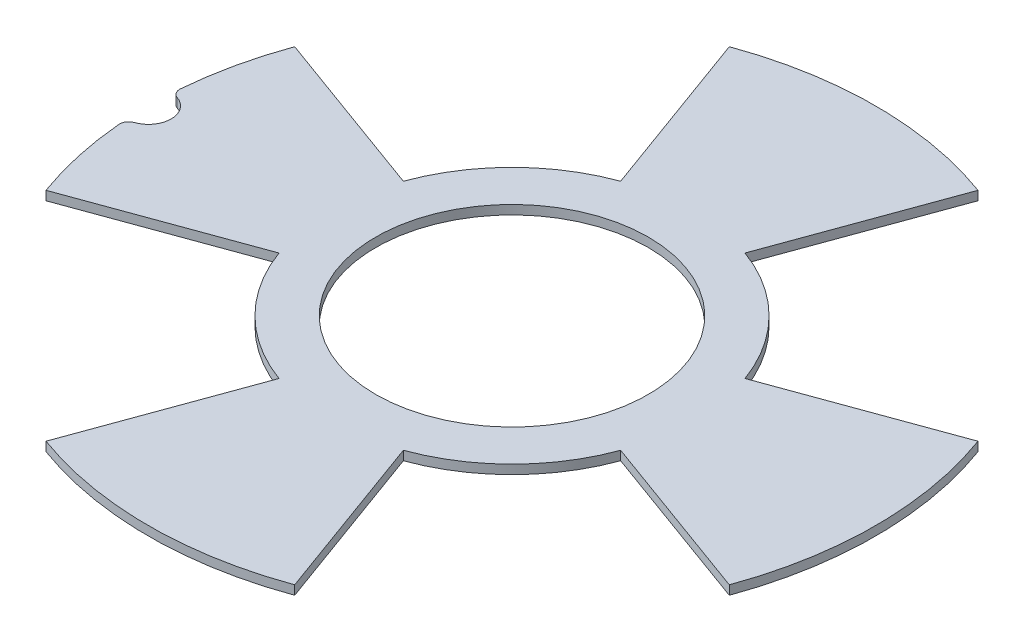
ISO-10303-21;
HEADER;
FILE_DESCRIPTION(('STEP AP214'),'2;1');
FILE_NAME('part.step','',(''),(''),'','','');
FILE_SCHEMA(('AUTOMOTIVE_DESIGN { 1 0 10303 214 1 1 1 1 }'));
ENDSEC;
DATA;
#1=APPLICATION_CONTEXT('core data for automotive mechanical design processes');
#2=APPLICATION_PROTOCOL_DEFINITION('international standard','automotive_design',2000,#1);
#3=PRODUCT_CONTEXT('',#1,'mechanical');
#4=PRODUCT('Part','Part','',(#3));
#5=PRODUCT_RELATED_PRODUCT_CATEGORY('part','',(#4));
#6=PRODUCT_DEFINITION_FORMATION('','',#4);
#7=PRODUCT_DEFINITION_CONTEXT('part definition',#1,'design');
#8=PRODUCT_DEFINITION('design','',#6,#7);
#9=PRODUCT_DEFINITION_SHAPE('','',#8);
#10=(LENGTH_UNIT() NAMED_UNIT(*) SI_UNIT(.MILLI.,.METRE.));
#11=(NAMED_UNIT(*) PLANE_ANGLE_UNIT() SI_UNIT($,.RADIAN.));
#12=(NAMED_UNIT(*) SI_UNIT($,.STERADIAN.) SOLID_ANGLE_UNIT());
#13=UNCERTAINTY_MEASURE_WITH_UNIT(LENGTH_MEASURE(1.E-05),#10,'distance_accuracy_value','');
#14=(GEOMETRIC_REPRESENTATION_CONTEXT(3) GLOBAL_UNCERTAINTY_ASSIGNED_CONTEXT((#13)) GLOBAL_UNIT_ASSIGNED_CONTEXT((#10,
#11,#12)) REPRESENTATION_CONTEXT('',''));
#15=CARTESIAN_POINT('',(0.,0.,0.));
#16=DIRECTION('',(0.,0.,1.));
#17=DIRECTION('',(1.,0.,0.));
#18=AXIS2_PLACEMENT_3D('',#15,#16,#17);
#19=CARTESIAN_POINT('',(-38.859375,1.,-3.3089234819462));
#20=DIRECTION('',(0.,-1.,0.));
#21=DIRECTION('',(0.,0.,-1.));
#22=AXIS2_PLACEMENT_3D('',#19,#20,#21);
#23=PLANE('',#22);
#24=CARTESIAN_POINT('',(-38.859375,1.,-3.3089234819462));
#25=DIRECTION('',(0.,1.,0.));
#26=DIRECTION('',(0.,0.,-1.));
#27=AXIS2_PLACEMENT_3D('',#24,#25,#26);
#28=CIRCLE('',#27,0.999999999999999);
#29=CARTESIAN_POINT('',(-39.8557692307692,1.,-3.39376767379098));
#30=VERTEX_POINT('',#29);
#31=CARTESIAN_POINT('',(-39.1852678571429,1.,-2.36351677281871));
#32=VERTEX_POINT('',#31);
#33=EDGE_CURVE('E241',#30,#32,#28,.T.);
#34=ORIENTED_EDGE('',*,*,#33,.T.);
#35=CARTESIAN_POINT('',(-40.,1.,0.));
#36=DIRECTION('',(0.,-1.,0.));
#37=DIRECTION('',(0.,0.,1.));
#38=AXIS2_PLACEMENT_3D('',#35,#36,#37);
#39=CIRCLE('',#38,2.49999999999999);
#40=CARTESIAN_POINT('',(-39.1852678571429,1.,2.36351677281871));
#41=VERTEX_POINT('',#40);
#42=EDGE_CURVE('E129',#32,#41,#39,.T.);
#43=ORIENTED_EDGE('',*,*,#42,.T.);
#44=CARTESIAN_POINT('',(-38.859375,1.,3.3089234819462));
#45=DIRECTION('',(0.,1.,0.));
#46=DIRECTION('',(0.,0.,-1.));
#47=AXIS2_PLACEMENT_3D('',#44,#45,#46);
#48=CIRCLE('',#47,0.999999999999999);
#49=CARTESIAN_POINT('',(-39.8557692307692,1.,3.39376767379097));
#50=VERTEX_POINT('',#49);
#51=EDGE_CURVE('E292',#41,#50,#48,.T.);
#52=ORIENTED_EDGE('',*,*,#51,.T.);
#53=CARTESIAN_POINT('',(0.,1.,0.));
#54=DIRECTION('',(0.,1.,0.));
#55=DIRECTION('',(0.,0.,1.));
#56=AXIS2_PLACEMENT_3D('',#53,#54,#55);
#57=CIRCLE('',#56,40.);
#58=CARTESIAN_POINT('',(-37.5877048314363,1.,13.6808057330268));
#59=VERTEX_POINT('',#58);
#60=EDGE_CURVE('E311',#50,#59,#57,.T.);
#61=ORIENTED_EDGE('',*,*,#60,.T.);
#62=DIRECTION('',(0.939692620785908,0.,-0.342020143325669));
#63=VECTOR('',#62,1.);
#64=CARTESIAN_POINT('',(-18.7938524157182,1.,6.84040286651339));
#65=LINE('',#64,#63);
#66=CARTESIAN_POINT('',(-18.7938524157182,1.,6.84040286651339));
#67=VERTEX_POINT('',#66);
#68=EDGE_CURVE('E308',#59,#67,#65,.T.);
#69=ORIENTED_EDGE('',*,*,#68,.T.);
#70=CARTESIAN_POINT('',(0.,1.,0.));
#71=DIRECTION('',(0.,1.,0.));
#72=DIRECTION('',(0.,0.,1.));
#73=AXIS2_PLACEMENT_3D('',#70,#71,#72);
#74=CIRCLE('',#73,20.);
#75=CARTESIAN_POINT('',(-6.84040286651339,1.,18.7938524157182));
#76=VERTEX_POINT('',#75);
#77=EDGE_CURVE('E310',#67,#76,#74,.T.);
#78=ORIENTED_EDGE('',*,*,#77,.T.);
#79=DIRECTION('',(-0.342020143325669,0.,0.939692620785908));
#80=VECTOR('',#79,1.);
#81=CARTESIAN_POINT('',(-13.6808057330268,1.,37.5877048314363));
#82=LINE('',#81,#80);
#83=CARTESIAN_POINT('',(-13.6808057330268,1.,37.5877048314363));
#84=VERTEX_POINT('',#83);
#85=EDGE_CURVE('E313',#76,#84,#82,.T.);
#86=ORIENTED_EDGE('',*,*,#85,.T.);
#87=CARTESIAN_POINT('',(0.,1.,0.));
#88=DIRECTION('',(0.,1.,0.));
#89=DIRECTION('',(0.,0.,1.));
#90=AXIS2_PLACEMENT_3D('',#87,#88,#89);
#91=CIRCLE('',#90,40.);
#92=CARTESIAN_POINT('',(13.6808057330268,1.,37.5877048314363));
#93=VERTEX_POINT('',#92);
#94=EDGE_CURVE('E319',#84,#93,#91,.T.);
#95=ORIENTED_EDGE('',*,*,#94,.T.);
#96=DIRECTION('',(-0.34202014332567,0.,-0.939692620785908));
#97=VECTOR('',#96,1.);
#98=CARTESIAN_POINT('',(13.6808057330268,1.,37.5877048314363));
#99=LINE('',#98,#97);
#100=CARTESIAN_POINT('',(6.84040286651344,1.,18.7938524157181));
#101=VERTEX_POINT('',#100);
#102=EDGE_CURVE('E321',#93,#101,#99,.T.);
#103=ORIENTED_EDGE('',*,*,#102,.T.);
#104=CARTESIAN_POINT('',(0.,1.,0.));
#105=DIRECTION('',(0.,1.,0.));
#106=DIRECTION('',(0.,0.,1.));
#107=AXIS2_PLACEMENT_3D('',#104,#105,#106);
#108=CIRCLE('',#107,20.);
#109=CARTESIAN_POINT('',(18.7938524157133,1.,6.84040286652674));
#110=VERTEX_POINT('',#109);
#111=EDGE_CURVE('E323',#101,#110,#108,.T.);
#112=ORIENTED_EDGE('',*,*,#111,.T.);
#113=DIRECTION('',(0.939692620785908,0.,0.342020143325669));
#114=VECTOR('',#113,1.);
#115=CARTESIAN_POINT('',(37.5877048314315,1.,13.6808057330401));
#116=LINE('',#115,#114);
#117=CARTESIAN_POINT('',(37.5877048314315,1.,13.6808057330401));
#118=VERTEX_POINT('',#117);
#119=EDGE_CURVE('E325',#110,#118,#116,.T.);
#120=ORIENTED_EDGE('',*,*,#119,.T.);
#121=CARTESIAN_POINT('',(0.,1.,0.));
#122=DIRECTION('',(0.,1.,0.));
#123=DIRECTION('',(0.,0.,1.));
#124=AXIS2_PLACEMENT_3D('',#121,#122,#123);
#125=CIRCLE('',#124,40.);
#126=CARTESIAN_POINT('',(37.5877048314363,1.,-13.6808057330267));
#127=VERTEX_POINT('',#126);
#128=EDGE_CURVE('E327',#118,#127,#125,.T.);
#129=ORIENTED_EDGE('',*,*,#128,.T.);
#130=DIRECTION('',(-0.939692620785908,0.,0.342020143325669));
#131=VECTOR('',#130,1.);
#132=CARTESIAN_POINT('',(37.5877048314363,1.,-13.6808057330267));
#133=LINE('',#132,#131);
#134=CARTESIAN_POINT('',(18.7938524157182,1.,-6.84040286651334));
#135=VERTEX_POINT('',#134);
#136=EDGE_CURVE('E329',#127,#135,#133,.T.);
#137=ORIENTED_EDGE('',*,*,#136,.T.);
#138=CARTESIAN_POINT('',(0.,1.,0.));
#139=DIRECTION('',(0.,1.,0.));
#140=DIRECTION('',(0.,0.,1.));
#141=AXIS2_PLACEMENT_3D('',#138,#139,#140);
#142=CIRCLE('',#141,20.);
#143=CARTESIAN_POINT('',(6.84040286651338,1.,-18.7938524157182));
#144=VERTEX_POINT('',#143);
#145=EDGE_CURVE('E331',#135,#144,#142,.T.);
#146=ORIENTED_EDGE('',*,*,#145,.T.);
#147=DIRECTION('',(0.342020143325669,0.,-0.939692620785908));
#148=VECTOR('',#147,1.);
#149=CARTESIAN_POINT('',(6.84040286651339,1.,-18.7938524157182));
#150=LINE('',#149,#148);
#151=CARTESIAN_POINT('',(13.6808057330268,1.,-37.5877048314363));
#152=VERTEX_POINT('',#151);
#153=EDGE_CURVE('E333',#144,#152,#150,.T.);
#154=ORIENTED_EDGE('',*,*,#153,.T.);
#155=CARTESIAN_POINT('',(0.,1.,0.));
#156=DIRECTION('',(0.,1.,0.));
#157=DIRECTION('',(0.,0.,1.));
#158=AXIS2_PLACEMENT_3D('',#155,#156,#157);
#159=CIRCLE('',#158,40.);
#160=CARTESIAN_POINT('',(-13.6808057330267,1.,-37.5877048314363));
#161=VERTEX_POINT('',#160);
#162=EDGE_CURVE('E335',#152,#161,#159,.T.);
#163=ORIENTED_EDGE('',*,*,#162,.T.);
#164=DIRECTION('',(0.34202014332567,0.,0.939692620785908));
#165=VECTOR('',#164,1.);
#166=CARTESIAN_POINT('',(-6.84040286651334,1.,-18.7938524157182));
#167=LINE('',#166,#165);
#168=CARTESIAN_POINT('',(-6.84040286651334,1.,-18.7938524157182));
#169=VERTEX_POINT('',#168);
#170=EDGE_CURVE('E184',#161,#169,#167,.T.);
#171=ORIENTED_EDGE('',*,*,#170,.T.);
#172=CARTESIAN_POINT('',(0.,1.,0.));
#173=DIRECTION('',(0.,1.,0.));
#174=DIRECTION('',(0.,0.,1.));
#175=AXIS2_PLACEMENT_3D('',#172,#173,#174);
#176=CIRCLE('',#175,20.);
#177=CARTESIAN_POINT('',(-18.793852415723,1.,-6.84040286650003));
#178=VERTEX_POINT('',#177);
#179=EDGE_CURVE('E178',#169,#178,#176,.T.);
#180=ORIENTED_EDGE('',*,*,#179,.T.);
#181=DIRECTION('',(-0.939692620785908,0.,-0.34202014332567));
#182=VECTOR('',#181,1.);
#183=CARTESIAN_POINT('',(-18.793852415723,1.,-6.84040286650003));
#184=LINE('',#183,#182);
#185=CARTESIAN_POINT('',(-37.5877048314412,1.,-13.6808057330134));
#186=VERTEX_POINT('',#185);
#187=EDGE_CURVE('E182',#178,#186,#184,.T.);
#188=ORIENTED_EDGE('',*,*,#187,.T.);
#189=CARTESIAN_POINT('',(0.,1.,0.));
#190=DIRECTION('',(0.,1.,0.));
#191=DIRECTION('',(0.,0.,1.));
#192=AXIS2_PLACEMENT_3D('',#189,#190,#191);
#193=CIRCLE('',#192,40.);
#194=EDGE_CURVE('E50',#186,#30,#193,.T.);
#195=ORIENTED_EDGE('',*,*,#194,.T.);
#196=EDGE_LOOP('',(#34,#43,#52,#61,#69,#78,#86,#95,#103,#112,#120,#129,#137,#146,#154,#163,#171,
#180,#188,#195));
#197=FACE_BOUND('',#196,.T.);
#198=CARTESIAN_POINT('',(0.,1.,0.));
#199=DIRECTION('',(0.,1.,0.));
#200=DIRECTION('',(0.,0.,1.));
#201=AXIS2_PLACEMENT_3D('',#198,#199,#200);
#202=CIRCLE('',#201,15.);
#203=CARTESIAN_POINT('',(0.,1.,15.));
#204=VERTEX_POINT('',#203);
#205=EDGE_CURVE('E206',#204,#204,#202,.T.);
#206=ORIENTED_EDGE('',*,*,#205,.F.);
#207=EDGE_LOOP('',(#206));
#208=FACE_BOUND('',#207,.T.);
#209=ADVANCED_FACE('F33',(#197,#208),#23,.F.);
#210=CARTESIAN_POINT('',(-38.859375,0.,-3.3089234819462));
#211=DIRECTION('',(0.,-1.,0.));
#212=DIRECTION('',(0.,0.,-1.));
#213=AXIS2_PLACEMENT_3D('',#210,#211,#212);
#214=PLANE('',#213);
#215=CARTESIAN_POINT('',(-38.859375,0.,-3.3089234819462));
#216=DIRECTION('',(0.,1.,0.));
#217=DIRECTION('',(0.,0.,-1.));
#218=AXIS2_PLACEMENT_3D('',#215,#216,#217);
#219=CIRCLE('',#218,0.999999999999999);
#220=CARTESIAN_POINT('',(-39.8557692307692,0.,-3.39376767379098));
#221=VERTEX_POINT('',#220);
#222=CARTESIAN_POINT('',(-39.1852678571429,0.,-2.36351677281871));
#223=VERTEX_POINT('',#222);
#224=EDGE_CURVE('E202',#221,#223,#219,.T.);
#225=ORIENTED_EDGE('',*,*,#224,.F.);
#226=CARTESIAN_POINT('',(0.,0.,0.));
#227=DIRECTION('',(0.,1.,0.));
#228=DIRECTION('',(0.,0.,1.));
#229=AXIS2_PLACEMENT_3D('',#226,#227,#228);
#230=CIRCLE('',#229,40.);
#231=CARTESIAN_POINT('',(-37.5877048314412,0.,-13.6808057330134));
#232=VERTEX_POINT('',#231);
#233=EDGE_CURVE('E121',#232,#221,#230,.T.);
#234=ORIENTED_EDGE('',*,*,#233,.F.);
#235=DIRECTION('',(-0.939692620785908,0.,-0.34202014332567));
#236=VECTOR('',#235,1.);
#237=CARTESIAN_POINT('',(-18.793852415723,0.,-6.84040286650003));
#238=LINE('',#237,#236);
#239=CARTESIAN_POINT('',(-18.793852415723,0.,-6.84040286650003));
#240=VERTEX_POINT('',#239);
#241=EDGE_CURVE('E115',#240,#232,#238,.T.);
#242=ORIENTED_EDGE('',*,*,#241,.F.);
#243=CARTESIAN_POINT('',(0.,0.,0.));
#244=DIRECTION('',(0.,1.,0.));
#245=DIRECTION('',(0.,0.,1.));
#246=AXIS2_PLACEMENT_3D('',#243,#244,#245);
#247=CIRCLE('',#246,20.);
#248=CARTESIAN_POINT('',(-6.84040286651334,0.,-18.7938524157182));
#249=VERTEX_POINT('',#248);
#250=EDGE_CURVE('E192',#249,#240,#247,.T.);
#251=ORIENTED_EDGE('',*,*,#250,.F.);
#252=DIRECTION('',(0.34202014332567,0.,0.939692620785908));
#253=VECTOR('',#252,1.);
#254=CARTESIAN_POINT('',(-6.84040286651334,0.,-18.7938524157182));
#255=LINE('',#254,#253);
#256=CARTESIAN_POINT('',(-13.6808057330267,0.,-37.5877048314363));
#257=VERTEX_POINT('',#256);
#258=EDGE_CURVE('E236',#257,#249,#255,.T.);
#259=ORIENTED_EDGE('',*,*,#258,.F.);
#260=CARTESIAN_POINT('',(0.,0.,0.));
#261=DIRECTION('',(0.,1.,0.));
#262=DIRECTION('',(0.,0.,1.));
#263=AXIS2_PLACEMENT_3D('',#260,#261,#262);
#264=CIRCLE('',#263,40.);
#265=CARTESIAN_POINT('',(13.6808057330268,0.,-37.5877048314363));
#266=VERTEX_POINT('',#265);
#267=EDGE_CURVE('E234',#266,#257,#264,.T.);
#268=ORIENTED_EDGE('',*,*,#267,.F.);
#269=DIRECTION('',(0.342020143325669,0.,-0.939692620785908));
#270=VECTOR('',#269,1.);
#271=CARTESIAN_POINT('',(6.84040286651339,0.,-18.7938524157182));
#272=LINE('',#271,#270);
#273=CARTESIAN_POINT('',(6.84040286651338,0.,-18.7938524157182));
#274=VERTEX_POINT('',#273);
#275=EDGE_CURVE('E232',#274,#266,#272,.T.);
#276=ORIENTED_EDGE('',*,*,#275,.F.);
#277=CARTESIAN_POINT('',(0.,0.,0.));
#278=DIRECTION('',(0.,1.,0.));
#279=DIRECTION('',(0.,0.,1.));
#280=AXIS2_PLACEMENT_3D('',#277,#278,#279);
#281=CIRCLE('',#280,20.);
#282=CARTESIAN_POINT('',(18.7938524157182,0.,-6.84040286651334));
#283=VERTEX_POINT('',#282);
#284=EDGE_CURVE('E230',#283,#274,#281,.T.);
#285=ORIENTED_EDGE('',*,*,#284,.F.);
#286=DIRECTION('',(-0.939692620785908,0.,0.342020143325669));
#287=VECTOR('',#286,1.);
#288=CARTESIAN_POINT('',(37.5877048314363,0.,-13.6808057330267));
#289=LINE('',#288,#287);
#290=CARTESIAN_POINT('',(37.5877048314363,0.,-13.6808057330267));
#291=VERTEX_POINT('',#290);
#292=EDGE_CURVE('E228',#291,#283,#289,.T.);
#293=ORIENTED_EDGE('',*,*,#292,.F.);
#294=CARTESIAN_POINT('',(0.,0.,0.));
#295=DIRECTION('',(0.,1.,0.));
#296=DIRECTION('',(0.,0.,1.));
#297=AXIS2_PLACEMENT_3D('',#294,#295,#296);
#298=CIRCLE('',#297,40.);
#299=CARTESIAN_POINT('',(37.5877048314315,0.,13.6808057330401));
#300=VERTEX_POINT('',#299);
#301=EDGE_CURVE('E226',#300,#291,#298,.T.);
#302=ORIENTED_EDGE('',*,*,#301,.F.);
#303=DIRECTION('',(0.939692620785908,0.,0.342020143325669));
#304=VECTOR('',#303,1.);
#305=CARTESIAN_POINT('',(37.5877048314315,0.,13.6808057330401));
#306=LINE('',#305,#304);
#307=CARTESIAN_POINT('',(18.7938524157133,0.,6.84040286652674));
#308=VERTEX_POINT('',#307);
#309=EDGE_CURVE('E224',#308,#300,#306,.T.);
#310=ORIENTED_EDGE('',*,*,#309,.F.);
#311=CARTESIAN_POINT('',(0.,0.,0.));
#312=DIRECTION('',(0.,1.,0.));
#313=DIRECTION('',(0.,0.,1.));
#314=AXIS2_PLACEMENT_3D('',#311,#312,#313);
#315=CIRCLE('',#314,20.);
#316=CARTESIAN_POINT('',(6.84040286651344,0.,18.7938524157181));
#317=VERTEX_POINT('',#316);
#318=EDGE_CURVE('E222',#317,#308,#315,.T.);
#319=ORIENTED_EDGE('',*,*,#318,.F.);
#320=DIRECTION('',(-0.34202014332567,0.,-0.939692620785908));
#321=VECTOR('',#320,1.);
#322=CARTESIAN_POINT('',(13.6808057330268,0.,37.5877048314363));
#323=LINE('',#322,#321);
#324=CARTESIAN_POINT('',(13.6808057330268,0.,37.5877048314363));
#325=VERTEX_POINT('',#324);
#326=EDGE_CURVE('E220',#325,#317,#323,.T.);
#327=ORIENTED_EDGE('',*,*,#326,.F.);
#328=CARTESIAN_POINT('',(0.,0.,0.));
#329=DIRECTION('',(0.,1.,0.));
#330=DIRECTION('',(0.,0.,1.));
#331=AXIS2_PLACEMENT_3D('',#328,#329,#330);
#332=CIRCLE('',#331,40.);
#333=CARTESIAN_POINT('',(-13.6808057330268,0.,37.5877048314363));
#334=VERTEX_POINT('',#333);
#335=EDGE_CURVE('E218',#334,#325,#332,.T.);
#336=ORIENTED_EDGE('',*,*,#335,.F.);
#337=DIRECTION('',(-0.342020143325669,0.,0.939692620785908));
#338=VECTOR('',#337,1.);
#339=CARTESIAN_POINT('',(-13.6808057330268,0.,37.5877048314363));
#340=LINE('',#339,#338);
#341=CARTESIAN_POINT('',(-6.84040286651339,0.,18.7938524157182));
#342=VERTEX_POINT('',#341);
#343=EDGE_CURVE('E216',#342,#334,#340,.T.);
#344=ORIENTED_EDGE('',*,*,#343,.F.);
#345=CARTESIAN_POINT('',(0.,0.,0.));
#346=DIRECTION('',(0.,1.,0.));
#347=DIRECTION('',(0.,0.,1.));
#348=AXIS2_PLACEMENT_3D('',#345,#346,#347);
#349=CIRCLE('',#348,20.);
#350=CARTESIAN_POINT('',(-18.7938524157182,0.,6.84040286651339));
#351=VERTEX_POINT('',#350);
#352=EDGE_CURVE('E214',#351,#342,#349,.T.);
#353=ORIENTED_EDGE('',*,*,#352,.F.);
#354=DIRECTION('',(0.939692620785908,0.,-0.342020143325669));
#355=VECTOR('',#354,1.);
#356=CARTESIAN_POINT('',(-18.7938524157182,0.,6.84040286651339));
#357=LINE('',#356,#355);
#358=CARTESIAN_POINT('',(-37.5877048314363,0.,13.6808057330268));
#359=VERTEX_POINT('',#358);
#360=EDGE_CURVE('E212',#359,#351,#357,.T.);
#361=ORIENTED_EDGE('',*,*,#360,.F.);
#362=CARTESIAN_POINT('',(0.,0.,0.));
#363=DIRECTION('',(0.,1.,0.));
#364=DIRECTION('',(0.,0.,1.));
#365=AXIS2_PLACEMENT_3D('',#362,#363,#364);
#366=CIRCLE('',#365,40.);
#367=CARTESIAN_POINT('',(-39.8557692307692,0.,3.39376767379097));
#368=VERTEX_POINT('',#367);
#369=EDGE_CURVE('E210',#368,#359,#366,.T.);
#370=ORIENTED_EDGE('',*,*,#369,.F.);
#371=CARTESIAN_POINT('',(-38.859375,0.,3.3089234819462));
#372=DIRECTION('',(0.,1.,0.));
#373=DIRECTION('',(0.,0.,-1.));
#374=AXIS2_PLACEMENT_3D('',#371,#372,#373);
#375=CIRCLE('',#374,0.999999999999999);
#376=CARTESIAN_POINT('',(-39.1852678571429,0.,2.36351677281871));
#377=VERTEX_POINT('',#376);
#378=EDGE_CURVE('E208',#377,#368,#375,.T.);
#379=ORIENTED_EDGE('',*,*,#378,.F.);
#380=CARTESIAN_POINT('',(-40.,0.,0.));
#381=DIRECTION('',(0.,-1.,0.));
#382=DIRECTION('',(0.,0.,1.));
#383=AXIS2_PLACEMENT_3D('',#380,#381,#382);
#384=CIRCLE('',#383,2.49999999999999);
#385=EDGE_CURVE('E205',#223,#377,#384,.T.);
#386=ORIENTED_EDGE('',*,*,#385,.F.);
#387=EDGE_LOOP('',(#225,#234,#242,#251,#259,#268,#276,#285,#293,#302,#310,#319,#327,#336,#344,
#353,#361,#370,#379,#386));
#388=FACE_BOUND('',#387,.T.);
#389=CARTESIAN_POINT('',(0.,0.,0.));
#390=DIRECTION('',(0.,1.,0.));
#391=DIRECTION('',(0.,0.,1.));
#392=AXIS2_PLACEMENT_3D('',#389,#390,#391);
#393=CIRCLE('',#392,15.);
#394=CARTESIAN_POINT('',(0.,0.,15.));
#395=VERTEX_POINT('',#394);
#396=EDGE_CURVE('E586',#395,#395,#393,.T.);
#397=ORIENTED_EDGE('',*,*,#396,.T.);
#398=EDGE_LOOP('',(#397));
#399=FACE_BOUND('',#398,.T.);
#400=ADVANCED_FACE('F296',(#388,#399),#214,.T.);
#401=CARTESIAN_POINT('',(-38.859375,1.,-3.3089234819462));
#402=DIRECTION('',(0.,-1.,0.));
#403=DIRECTION('',(0.,0.,-1.));
#404=AXIS2_PLACEMENT_3D('',#401,#402,#403);
#405=CYLINDRICAL_SURFACE('',#404,0.999999999999999);
#406=ORIENTED_EDGE('',*,*,#224,.T.);
#407=DIRECTION('',(0.,-1.,0.));
#408=VECTOR('',#407,1.);
#409=CARTESIAN_POINT('',(-39.1852678571429,1.,-2.36351677281871));
#410=LINE('',#409,#408);
#411=EDGE_CURVE('E11',#32,#223,#410,.T.);
#412=ORIENTED_EDGE('',*,*,#411,.F.);
#413=ORIENTED_EDGE('',*,*,#33,.F.);
#414=DIRECTION('',(0.,-1.,0.));
#415=VECTOR('',#414,1.);
#416=CARTESIAN_POINT('',(-39.8557692307692,1.,-3.39376767379098));
#417=LINE('',#416,#415);
#418=EDGE_CURVE('E198',#30,#221,#417,.T.);
#419=ORIENTED_EDGE('',*,*,#418,.T.);
#420=EDGE_LOOP('',(#406,#412,#413,#419));
#421=FACE_BOUND('',#420,.T.);
#422=ADVANCED_FACE('F35',(#421),#405,.T.);
#423=CARTESIAN_POINT('',(-40.,1.,0.));
#424=DIRECTION('',(0.,-1.,0.));
#425=DIRECTION('',(0.,0.,-1.));
#426=AXIS2_PLACEMENT_3D('',#423,#424,#425);
#427=CYLINDRICAL_SURFACE('',#426,2.49999999999999);
#428=ORIENTED_EDGE('',*,*,#385,.T.);
#429=DIRECTION('',(0.,-1.,0.));
#430=VECTOR('',#429,1.);
#431=CARTESIAN_POINT('',(-39.1852678571429,1.,2.36351677281871));
#432=LINE('',#431,#430);
#433=EDGE_CURVE('E42',#41,#377,#432,.T.);
#434=ORIENTED_EDGE('',*,*,#433,.F.);
#435=ORIENTED_EDGE('',*,*,#42,.F.);
#436=ORIENTED_EDGE('',*,*,#411,.T.);
#437=EDGE_LOOP('',(#428,#434,#435,#436));
#438=FACE_BOUND('',#437,.T.);
#439=ADVANCED_FACE('F369',(#438),#427,.F.);
#440=CARTESIAN_POINT('',(-38.859375,1.,3.3089234819462));
#441=DIRECTION('',(0.,-1.,0.));
#442=DIRECTION('',(0.,0.,-1.));
#443=AXIS2_PLACEMENT_3D('',#440,#441,#442);
#444=CYLINDRICAL_SURFACE('',#443,0.999999999999999);
#445=ORIENTED_EDGE('',*,*,#378,.T.);
#446=DIRECTION('',(0.,-1.,0.));
#447=VECTOR('',#446,1.);
#448=CARTESIAN_POINT('',(-39.8557692307692,1.,3.39376767379097));
#449=LINE('',#448,#447);
#450=EDGE_CURVE('E284',#50,#368,#449,.T.);
#451=ORIENTED_EDGE('',*,*,#450,.F.);
#452=ORIENTED_EDGE('',*,*,#51,.F.);
#453=ORIENTED_EDGE('',*,*,#433,.T.);
#454=EDGE_LOOP('',(#445,#451,#452,#453));
#455=FACE_BOUND('',#454,.T.);
#456=ADVANCED_FACE('F290',(#455),#444,.T.);
#457=CARTESIAN_POINT('',(0.,1.,0.));
#458=DIRECTION('',(0.,-1.,0.));
#459=DIRECTION('',(0.,0.,-1.));
#460=AXIS2_PLACEMENT_3D('',#457,#458,#459);
#461=CYLINDRICAL_SURFACE('',#460,40.);
#462=ORIENTED_EDGE('',*,*,#369,.T.);
#463=DIRECTION('',(0.,-1.,0.));
#464=VECTOR('',#463,1.);
#465=CARTESIAN_POINT('',(-37.5877048314363,1.,13.6808057330268));
#466=LINE('',#465,#464);
#467=EDGE_CURVE('E281',#59,#359,#466,.T.);
#468=ORIENTED_EDGE('',*,*,#467,.F.);
#469=ORIENTED_EDGE('',*,*,#60,.F.);
#470=ORIENTED_EDGE('',*,*,#450,.T.);
#471=EDGE_LOOP('',(#462,#468,#469,#470));
#472=FACE_BOUND('',#471,.T.);
#473=ADVANCED_FACE('F302',(#472),#461,.T.);
#474=CARTESIAN_POINT('',(-18.7938524157182,1.,6.84040286651339));
#475=DIRECTION('',(-0.342020143325669,0.,-0.939692620785908));
#476=DIRECTION('',(-0.939692620785908,0.,0.342020143325669));
#477=AXIS2_PLACEMENT_3D('',#474,#475,#476);
#478=PLANE('',#477);
#479=ORIENTED_EDGE('',*,*,#360,.T.);
#480=DIRECTION('',(0.,-1.,0.));
#481=VECTOR('',#480,1.);
#482=CARTESIAN_POINT('',(-18.7938524157182,1.,6.84040286651339));
#483=LINE('',#482,#481);
#484=EDGE_CURVE('E278',#67,#351,#483,.T.);
#485=ORIENTED_EDGE('',*,*,#484,.F.);
#486=ORIENTED_EDGE('',*,*,#68,.F.);
#487=ORIENTED_EDGE('',*,*,#467,.T.);
#488=EDGE_LOOP('',(#479,#485,#486,#487));
#489=FACE_BOUND('',#488,.T.);
#490=ADVANCED_FACE('F306',(#489),#478,.F.);
#491=CARTESIAN_POINT('',(0.,1.,0.));
#492=DIRECTION('',(0.,-1.,0.));
#493=DIRECTION('',(0.,0.,-1.));
#494=AXIS2_PLACEMENT_3D('',#491,#492,#493);
#495=CYLINDRICAL_SURFACE('',#494,20.);
#496=ORIENTED_EDGE('',*,*,#352,.T.);
#497=DIRECTION('',(0.,-1.,0.));
#498=VECTOR('',#497,1.);
#499=CARTESIAN_POINT('',(-6.84040286651339,1.,18.7938524157182));
#500=LINE('',#499,#498);
#501=EDGE_CURVE('E275',#76,#342,#500,.T.);
#502=ORIENTED_EDGE('',*,*,#501,.F.);
#503=ORIENTED_EDGE('',*,*,#77,.F.);
#504=ORIENTED_EDGE('',*,*,#484,.T.);
#505=EDGE_LOOP('',(#496,#502,#503,#504));
#506=FACE_BOUND('',#505,.T.);
#507=ADVANCED_FACE('F382',(#506),#495,.T.);
#508=CARTESIAN_POINT('',(-13.6808057330268,1.,37.5877048314363));
#509=DIRECTION('',(0.939692620785908,0.,0.342020143325669));
#510=DIRECTION('',(0.342020143325669,0.,-0.939692620785908));
#511=AXIS2_PLACEMENT_3D('',#508,#509,#510);
#512=PLANE('',#511);
#513=ORIENTED_EDGE('',*,*,#343,.T.);
#514=DIRECTION('',(0.,-1.,0.));
#515=VECTOR('',#514,1.);
#516=CARTESIAN_POINT('',(-13.6808057330268,1.,37.5877048314363));
#517=LINE('',#516,#515);
#518=EDGE_CURVE('E272',#84,#334,#517,.T.);
#519=ORIENTED_EDGE('',*,*,#518,.F.);
#520=ORIENTED_EDGE('',*,*,#85,.F.);
#521=ORIENTED_EDGE('',*,*,#501,.T.);
#522=EDGE_LOOP('',(#513,#519,#520,#521));
#523=FACE_BOUND('',#522,.T.);
#524=ADVANCED_FACE('F385',(#523),#512,.F.);
#525=CARTESIAN_POINT('',(0.,1.,0.));
#526=DIRECTION('',(0.,-1.,0.));
#527=DIRECTION('',(0.,0.,-1.));
#528=AXIS2_PLACEMENT_3D('',#525,#526,#527);
#529=CYLINDRICAL_SURFACE('',#528,40.);
#530=ORIENTED_EDGE('',*,*,#335,.T.);
#531=DIRECTION('',(0.,-1.,0.));
#532=VECTOR('',#531,1.);
#533=CARTESIAN_POINT('',(13.6808057330268,1.,37.5877048314363));
#534=LINE('',#533,#532);
#535=EDGE_CURVE('E269',#93,#325,#534,.T.);
#536=ORIENTED_EDGE('',*,*,#535,.F.);
#537=ORIENTED_EDGE('',*,*,#94,.F.);
#538=ORIENTED_EDGE('',*,*,#518,.T.);
#539=EDGE_LOOP('',(#530,#536,#537,#538));
#540=FACE_BOUND('',#539,.T.);
#541=ADVANCED_FACE('F389',(#540),#529,.T.);
#542=CARTESIAN_POINT('',(13.6808057330268,1.,37.5877048314363));
#543=DIRECTION('',(-0.939692620785908,0.,0.34202014332567));
#544=DIRECTION('',(0.34202014332567,0.,0.939692620785908));
#545=AXIS2_PLACEMENT_3D('',#542,#543,#544);
#546=PLANE('',#545);
#547=ORIENTED_EDGE('',*,*,#326,.T.);
#548=DIRECTION('',(0.,-1.,0.));
#549=VECTOR('',#548,1.);
#550=CARTESIAN_POINT('',(6.84040286651344,1.,18.7938524157181));
#551=LINE('',#550,#549);
#552=EDGE_CURVE('E266',#101,#317,#551,.T.);
#553=ORIENTED_EDGE('',*,*,#552,.F.);
#554=ORIENTED_EDGE('',*,*,#102,.F.);
#555=ORIENTED_EDGE('',*,*,#535,.T.);
#556=EDGE_LOOP('',(#547,#553,#554,#555));
#557=FACE_BOUND('',#556,.T.);
#558=ADVANCED_FACE('F393',(#557),#546,.F.);
#559=CARTESIAN_POINT('',(0.,1.,0.));
#560=DIRECTION('',(0.,-1.,0.));
#561=DIRECTION('',(0.,0.,-1.));
#562=AXIS2_PLACEMENT_3D('',#559,#560,#561);
#563=CYLINDRICAL_SURFACE('',#562,20.);
#564=ORIENTED_EDGE('',*,*,#318,.T.);
#565=DIRECTION('',(0.,-1.,0.));
#566=VECTOR('',#565,1.);
#567=CARTESIAN_POINT('',(18.7938524157133,1.,6.84040286652674));
#568=LINE('',#567,#566);
#569=EDGE_CURVE('E263',#110,#308,#568,.T.);
#570=ORIENTED_EDGE('',*,*,#569,.F.);
#571=ORIENTED_EDGE('',*,*,#111,.F.);
#572=ORIENTED_EDGE('',*,*,#552,.T.);
#573=EDGE_LOOP('',(#564,#570,#571,#572));
#574=FACE_BOUND('',#573,.T.);
#575=ADVANCED_FACE('F397',(#574),#563,.T.);
#576=CARTESIAN_POINT('',(37.5877048314315,1.,13.6808057330401));
#577=DIRECTION('',(0.342020143325669,0.,-0.939692620785908));
#578=DIRECTION('',(-0.939692620785908,0.,-0.342020143325669));
#579=AXIS2_PLACEMENT_3D('',#576,#577,#578);
#580=PLANE('',#579);
#581=ORIENTED_EDGE('',*,*,#309,.T.);
#582=DIRECTION('',(0.,-1.,0.));
#583=VECTOR('',#582,1.);
#584=CARTESIAN_POINT('',(37.5877048314315,1.,13.6808057330401));
#585=LINE('',#584,#583);
#586=EDGE_CURVE('E260',#118,#300,#585,.T.);
#587=ORIENTED_EDGE('',*,*,#586,.F.);
#588=ORIENTED_EDGE('',*,*,#119,.F.);
#589=ORIENTED_EDGE('',*,*,#569,.T.);
#590=EDGE_LOOP('',(#581,#587,#588,#589));
#591=FACE_BOUND('',#590,.T.);
#592=ADVANCED_FACE('F401',(#591),#580,.F.);
#593=CARTESIAN_POINT('',(0.,1.,0.));
#594=DIRECTION('',(0.,-1.,0.));
#595=DIRECTION('',(0.,0.,-1.));
#596=AXIS2_PLACEMENT_3D('',#593,#594,#595);
#597=CYLINDRICAL_SURFACE('',#596,40.);
#598=ORIENTED_EDGE('',*,*,#301,.T.);
#599=DIRECTION('',(0.,-1.,0.));
#600=VECTOR('',#599,1.);
#601=CARTESIAN_POINT('',(37.5877048314363,1.,-13.6808057330267));
#602=LINE('',#601,#600);
#603=EDGE_CURVE('E257',#127,#291,#602,.T.);
#604=ORIENTED_EDGE('',*,*,#603,.F.);
#605=ORIENTED_EDGE('',*,*,#128,.F.);
#606=ORIENTED_EDGE('',*,*,#586,.T.);
#607=EDGE_LOOP('',(#598,#604,#605,#606));
#608=FACE_BOUND('',#607,.T.);
#609=ADVANCED_FACE('F405',(#608),#597,.T.);
#610=CARTESIAN_POINT('',(37.5877048314363,1.,-13.6808057330267));
#611=DIRECTION('',(0.342020143325669,0.,0.939692620785908));
#612=DIRECTION('',(0.939692620785908,0.,-0.342020143325669));
#613=AXIS2_PLACEMENT_3D('',#610,#611,#612);
#614=PLANE('',#613);
#615=ORIENTED_EDGE('',*,*,#292,.T.);
#616=DIRECTION('',(0.,-1.,0.));
#617=VECTOR('',#616,1.);
#618=CARTESIAN_POINT('',(18.7938524157182,1.,-6.84040286651334));
#619=LINE('',#618,#617);
#620=EDGE_CURVE('E254',#135,#283,#619,.T.);
#621=ORIENTED_EDGE('',*,*,#620,.F.);
#622=ORIENTED_EDGE('',*,*,#136,.F.);
#623=ORIENTED_EDGE('',*,*,#603,.T.);
#624=EDGE_LOOP('',(#615,#621,#622,#623));
#625=FACE_BOUND('',#624,.T.);
#626=ADVANCED_FACE('F409',(#625),#614,.F.);
#627=CARTESIAN_POINT('',(0.,1.,0.));
#628=DIRECTION('',(0.,-1.,0.));
#629=DIRECTION('',(0.,0.,-1.));
#630=AXIS2_PLACEMENT_3D('',#627,#628,#629);
#631=CYLINDRICAL_SURFACE('',#630,20.);
#632=ORIENTED_EDGE('',*,*,#284,.T.);
#633=DIRECTION('',(0.,-1.,0.));
#634=VECTOR('',#633,1.);
#635=CARTESIAN_POINT('',(6.84040286651338,1.,-18.7938524157182));
#636=LINE('',#635,#634);
#637=EDGE_CURVE('E251',#144,#274,#636,.T.);
#638=ORIENTED_EDGE('',*,*,#637,.F.);
#639=ORIENTED_EDGE('',*,*,#145,.F.);
#640=ORIENTED_EDGE('',*,*,#620,.T.);
#641=EDGE_LOOP('',(#632,#638,#639,#640));
#642=FACE_BOUND('',#641,.T.);
#643=ADVANCED_FACE('F413',(#642),#631,.T.);
#644=CARTESIAN_POINT('',(6.84040286651339,1.,-18.7938524157182));
#645=DIRECTION('',(-0.939692620785908,0.,-0.342020143325669));
#646=DIRECTION('',(-0.342020143325669,0.,0.939692620785908));
#647=AXIS2_PLACEMENT_3D('',#644,#645,#646);
#648=PLANE('',#647);
#649=ORIENTED_EDGE('',*,*,#275,.T.);
#650=DIRECTION('',(0.,-1.,0.));
#651=VECTOR('',#650,1.);
#652=CARTESIAN_POINT('',(13.6808057330268,1.,-37.5877048314363));
#653=LINE('',#652,#651);
#654=EDGE_CURVE('E248',#152,#266,#653,.T.);
#655=ORIENTED_EDGE('',*,*,#654,.F.);
#656=ORIENTED_EDGE('',*,*,#153,.F.);
#657=ORIENTED_EDGE('',*,*,#637,.T.);
#658=EDGE_LOOP('',(#649,#655,#656,#657));
#659=FACE_BOUND('',#658,.T.);
#660=ADVANCED_FACE('F417',(#659),#648,.F.);
#661=CARTESIAN_POINT('',(0.,1.,0.));
#662=DIRECTION('',(0.,-1.,0.));
#663=DIRECTION('',(0.,0.,-1.));
#664=AXIS2_PLACEMENT_3D('',#661,#662,#663);
#665=CYLINDRICAL_SURFACE('',#664,40.);
#666=ORIENTED_EDGE('',*,*,#267,.T.);
#667=DIRECTION('',(0.,-1.,0.));
#668=VECTOR('',#667,1.);
#669=CARTESIAN_POINT('',(-13.6808057330267,1.,-37.5877048314363));
#670=LINE('',#669,#668);
#671=EDGE_CURVE('E245',#161,#257,#670,.T.);
#672=ORIENTED_EDGE('',*,*,#671,.F.);
#673=ORIENTED_EDGE('',*,*,#162,.F.);
#674=ORIENTED_EDGE('',*,*,#654,.T.);
#675=EDGE_LOOP('',(#666,#672,#673,#674));
#676=FACE_BOUND('',#675,.T.);
#677=ADVANCED_FACE('F341',(#676),#665,.T.);
#678=CARTESIAN_POINT('',(-6.84040286651334,1.,-18.7938524157182));
#679=DIRECTION('',(0.939692620785908,0.,-0.34202014332567));
#680=DIRECTION('',(-0.34202014332567,0.,-0.939692620785908));
#681=AXIS2_PLACEMENT_3D('',#678,#679,#680);
#682=PLANE('',#681);
#683=ORIENTED_EDGE('',*,*,#258,.T.);
#684=DIRECTION('',(0.,-1.,0.));
#685=VECTOR('',#684,1.);
#686=CARTESIAN_POINT('',(-6.84040286651334,1.,-18.7938524157182));
#687=LINE('',#686,#685);
#688=EDGE_CURVE('E193',#169,#249,#687,.T.);
#689=ORIENTED_EDGE('',*,*,#688,.F.);
#690=ORIENTED_EDGE('',*,*,#170,.F.);
#691=ORIENTED_EDGE('',*,*,#671,.T.);
#692=EDGE_LOOP('',(#683,#689,#690,#691));
#693=FACE_BOUND('',#692,.T.);
#694=ADVANCED_FACE('F345',(#693),#682,.F.);
#695=CARTESIAN_POINT('',(0.,1.,0.));
#696=DIRECTION('',(0.,-1.,0.));
#697=DIRECTION('',(0.,0.,-1.));
#698=AXIS2_PLACEMENT_3D('',#695,#696,#697);
#699=CYLINDRICAL_SURFACE('',#698,20.);
#700=ORIENTED_EDGE('',*,*,#250,.T.);
#701=DIRECTION('',(0.,-1.,0.));
#702=VECTOR('',#701,1.);
#703=CARTESIAN_POINT('',(-18.793852415723,1.,-6.84040286650003));
#704=LINE('',#703,#702);
#705=EDGE_CURVE('E189',#178,#240,#704,.T.);
#706=ORIENTED_EDGE('',*,*,#705,.F.);
#707=ORIENTED_EDGE('',*,*,#179,.F.);
#708=ORIENTED_EDGE('',*,*,#688,.T.);
#709=EDGE_LOOP('',(#700,#706,#707,#708));
#710=FACE_BOUND('',#709,.T.);
#711=ADVANCED_FACE('F190',(#710),#699,.T.);
#712=CARTESIAN_POINT('',(-18.793852415723,1.,-6.84040286650003));
#713=DIRECTION('',(-0.342020143325669,0.,0.939692620785908));
#714=DIRECTION('',(0.939692620785908,0.,0.342020143325669));
#715=AXIS2_PLACEMENT_3D('',#712,#713,#714);
#716=PLANE('',#715);
#717=ORIENTED_EDGE('',*,*,#241,.T.);
#718=DIRECTION('',(0.,-1.,0.));
#719=VECTOR('',#718,1.);
#720=CARTESIAN_POINT('',(-37.5877048314412,1.,-13.6808057330134));
#721=LINE('',#720,#719);
#722=EDGE_CURVE('E194',#186,#232,#721,.T.);
#723=ORIENTED_EDGE('',*,*,#722,.F.);
#724=ORIENTED_EDGE('',*,*,#187,.F.);
#725=ORIENTED_EDGE('',*,*,#705,.T.);
#726=EDGE_LOOP('',(#717,#723,#724,#725));
#727=FACE_BOUND('',#726,.T.);
#728=ADVANCED_FACE('F196',(#727),#716,.F.);
#729=CARTESIAN_POINT('',(0.,1.,0.));
#730=DIRECTION('',(0.,-1.,0.));
#731=DIRECTION('',(0.,0.,-1.));
#732=AXIS2_PLACEMENT_3D('',#729,#730,#731);
#733=CYLINDRICAL_SURFACE('',#732,40.);
#734=ORIENTED_EDGE('',*,*,#233,.T.);
#735=ORIENTED_EDGE('',*,*,#418,.F.);
#736=ORIENTED_EDGE('',*,*,#194,.F.);
#737=ORIENTED_EDGE('',*,*,#722,.T.);
#738=EDGE_LOOP('',(#734,#735,#736,#737));
#739=FACE_BOUND('',#738,.T.);
#740=ADVANCED_FACE('F349',(#739),#733,.T.);
#741=CARTESIAN_POINT('',(0.,1.,0.));
#742=DIRECTION('',(0.,-1.,0.));
#743=DIRECTION('',(0.,0.,-1.));
#744=AXIS2_PLACEMENT_3D('',#741,#742,#743);
#745=CYLINDRICAL_SURFACE('',#744,15.);
#746=ORIENTED_EDGE('',*,*,#205,.T.);
#747=EDGE_LOOP('',(#746));
#748=FACE_BOUND('',#747,.T.);
#749=ORIENTED_EDGE('',*,*,#396,.F.);
#750=EDGE_LOOP('',(#749));
#751=FACE_BOUND('',#750,.T.);
#752=ADVANCED_FACE('F351',(#748,#751),#745,.F.);
#753=CLOSED_SHELL('',(#209,#400,#422,#439,#456,#473,#490,#507,#524,#541,#558,#575,#592,#609,
#626,#643,#660,#677,#694,#711,#728,#740,#752));
#754=MANIFOLD_SOLID_BREP('B2',#753);
#755=ADVANCED_BREP_SHAPE_REPRESENTATION('',(#18,#754),#14);
#756=SHAPE_DEFINITION_REPRESENTATION(#9,#755);
ENDSEC;
END-ISO-10303-21;
